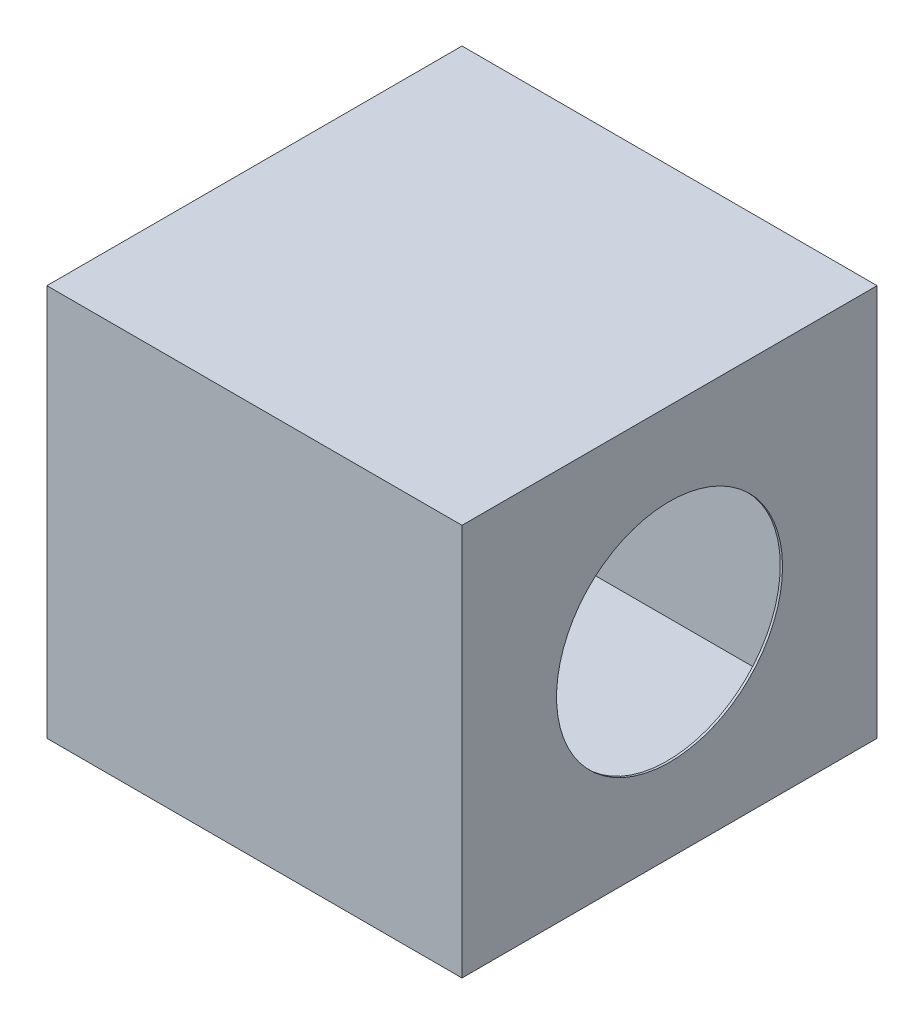
ISO-10303-21;
HEADER;
FILE_DESCRIPTION(('STEP AP214'),'2;1');
FILE_NAME('part.step','',(''),(''),'','','');
FILE_SCHEMA(('AUTOMOTIVE_DESIGN { 1 0 10303 214 1 1 1 1 }'));
ENDSEC;
DATA;
#1=APPLICATION_CONTEXT('core data for automotive mechanical design processes');
#2=APPLICATION_PROTOCOL_DEFINITION('international standard','automotive_design',2000,#1);
#3=PRODUCT_CONTEXT('',#1,'mechanical');
#4=PRODUCT('Part','Part','',(#3));
#5=PRODUCT_RELATED_PRODUCT_CATEGORY('part','',(#4));
#6=PRODUCT_DEFINITION_FORMATION('','',#4);
#7=PRODUCT_DEFINITION_CONTEXT('part definition',#1,'design');
#8=PRODUCT_DEFINITION('design','',#6,#7);
#9=PRODUCT_DEFINITION_SHAPE('','',#8);
#10=(LENGTH_UNIT() NAMED_UNIT(*) SI_UNIT(.MILLI.,.METRE.));
#11=(NAMED_UNIT(*) PLANE_ANGLE_UNIT() SI_UNIT($,.RADIAN.));
#12=(NAMED_UNIT(*) SI_UNIT($,.STERADIAN.) SOLID_ANGLE_UNIT());
#13=UNCERTAINTY_MEASURE_WITH_UNIT(LENGTH_MEASURE(1.E-05),#10,'distance_accuracy_value','');
#14=(GEOMETRIC_REPRESENTATION_CONTEXT(3) GLOBAL_UNCERTAINTY_ASSIGNED_CONTEXT((#13)) GLOBAL_UNIT_ASSIGNED_CONTEXT((#10,
#11,#12)) REPRESENTATION_CONTEXT('',''));
#15=CARTESIAN_POINT('',(0.,0.,0.));
#16=DIRECTION('',(0.,0.,1.));
#17=DIRECTION('',(1.,0.,0.));
#18=AXIS2_PLACEMENT_3D('',#15,#16,#17);
#19=CARTESIAN_POINT('',(90.,85.,90.));
#20=DIRECTION('',(-1.,0.,0.));
#21=DIRECTION('',(0.,0.,1.));
#22=AXIS2_PLACEMENT_3D('',#19,#20,#21);
#23=PLANE('',#22);
#24=CARTESIAN_POINT('',(90.,0.,0.));
#25=DIRECTION('',(1.,0.,0.));
#26=DIRECTION('',(0.,0.,-1.));
#27=AXIS2_PLACEMENT_3D('',#24,#25,#26);
#28=CIRCLE('',#27,49.);
#29=CARTESIAN_POINT('',(90.,0.,-49.));
#30=VERTEX_POINT('',#29);
#31=EDGE_CURVE('E147',#30,#30,#28,.T.);
#32=ORIENTED_EDGE('',*,*,#31,.F.);
#33=EDGE_LOOP('',(#32));
#34=FACE_BOUND('',#33,.T.);
#35=DIRECTION('',(0.,1.,0.));
#36=VECTOR('',#35,1.);
#37=CARTESIAN_POINT('',(90.,85.,-90.));
#38=LINE('',#37,#36);
#39=CARTESIAN_POINT('',(90.,-85.,-90.));
#40=VERTEX_POINT('',#39);
#41=CARTESIAN_POINT('',(90.,85.,-90.));
#42=VERTEX_POINT('',#41);
#43=EDGE_CURVE('E155',#40,#42,#38,.T.);
#44=ORIENTED_EDGE('',*,*,#43,.T.);
#45=DIRECTION('',(0.,0.,-1.));
#46=VECTOR('',#45,1.);
#47=CARTESIAN_POINT('',(90.,85.,90.));
#48=LINE('',#47,#46);
#49=CARTESIAN_POINT('',(90.,85.,90.));
#50=VERTEX_POINT('',#49);
#51=EDGE_CURVE('E11',#50,#42,#48,.T.);
#52=ORIENTED_EDGE('',*,*,#51,.F.);
#53=DIRECTION('',(0.,1.,0.));
#54=VECTOR('',#53,1.);
#55=CARTESIAN_POINT('',(90.,85.,90.));
#56=LINE('',#55,#54);
#57=CARTESIAN_POINT('',(90.,-85.,90.));
#58=VERTEX_POINT('',#57);
#59=EDGE_CURVE('E156',#58,#50,#56,.T.);
#60=ORIENTED_EDGE('',*,*,#59,.F.);
#61=DIRECTION('',(0.,0.,-1.));
#62=VECTOR('',#61,1.);
#63=CARTESIAN_POINT('',(90.,-85.,90.));
#64=LINE('',#63,#62);
#65=EDGE_CURVE('E162',#58,#40,#64,.T.);
#66=ORIENTED_EDGE('',*,*,#65,.T.);
#67=EDGE_LOOP('',(#44,#52,#60,#66));
#68=FACE_BOUND('',#67,.T.);
#69=ADVANCED_FACE('F33',(#34,#68),#23,.F.);
#70=CARTESIAN_POINT('',(-90.,85.,90.));
#71=DIRECTION('',(0.,-1.,0.));
#72=DIRECTION('',(1.,0.,0.));
#73=AXIS2_PLACEMENT_3D('',#70,#71,#72);
#74=PLANE('',#73);
#75=DIRECTION('',(-1.,0.,0.));
#76=VECTOR('',#75,1.);
#77=CARTESIAN_POINT('',(-90.,85.,-90.));
#78=LINE('',#77,#76);
#79=CARTESIAN_POINT('',(-90.,85.,-90.));
#80=VERTEX_POINT('',#79);
#81=EDGE_CURVE('E165',#42,#80,#78,.T.);
#82=ORIENTED_EDGE('',*,*,#81,.T.);
#83=DIRECTION('',(0.,0.,-1.));
#84=VECTOR('',#83,1.);
#85=CARTESIAN_POINT('',(-90.,85.,90.));
#86=LINE('',#85,#84);
#87=CARTESIAN_POINT('',(-90.,85.,90.));
#88=VERTEX_POINT('',#87);
#89=EDGE_CURVE('E41',#88,#80,#86,.T.);
#90=ORIENTED_EDGE('',*,*,#89,.F.);
#91=DIRECTION('',(-1.,0.,0.));
#92=VECTOR('',#91,1.);
#93=CARTESIAN_POINT('',(-90.,85.,90.));
#94=LINE('',#93,#92);
#95=EDGE_CURVE('E80',#50,#88,#94,.T.);
#96=ORIENTED_EDGE('',*,*,#95,.F.);
#97=ORIENTED_EDGE('',*,*,#51,.T.);
#98=EDGE_LOOP('',(#82,#90,#96,#97));
#99=FACE_BOUND('',#98,.T.);
#100=ADVANCED_FACE('F188',(#99),#74,.F.);
#101=CARTESIAN_POINT('',(-90.,85.,90.));
#102=DIRECTION('',(1.,0.,0.));
#103=DIRECTION('',(0.,0.,-1.));
#104=AXIS2_PLACEMENT_3D('',#101,#102,#103);
#105=PLANE('',#104);
#106=CARTESIAN_POINT('',(-90.,0.,0.));
#107=DIRECTION('',(-1.,0.,0.));
#108=DIRECTION('',(0.,0.,1.));
#109=AXIS2_PLACEMENT_3D('',#106,#107,#108);
#110=CIRCLE('',#109,49.);
#111=CARTESIAN_POINT('',(-90.,0.,49.));
#112=VERTEX_POINT('',#111);
#113=EDGE_CURVE('E150',#112,#112,#110,.T.);
#114=ORIENTED_EDGE('',*,*,#113,.F.);
#115=EDGE_LOOP('',(#114));
#116=FACE_BOUND('',#115,.T.);
#117=DIRECTION('',(0.,-1.,0.));
#118=VECTOR('',#117,1.);
#119=CARTESIAN_POINT('',(-90.,85.,-90.));
#120=LINE('',#119,#118);
#121=CARTESIAN_POINT('',(-90.,-85.,-90.));
#122=VERTEX_POINT('',#121);
#123=EDGE_CURVE('E67',#80,#122,#120,.T.);
#124=ORIENTED_EDGE('',*,*,#123,.T.);
#125=DIRECTION('',(0.,0.,-1.));
#126=VECTOR('',#125,1.);
#127=CARTESIAN_POINT('',(-90.,-85.,90.));
#128=LINE('',#127,#126);
#129=CARTESIAN_POINT('',(-90.,-85.,90.));
#130=VERTEX_POINT('',#129);
#131=EDGE_CURVE('E170',#130,#122,#128,.T.);
#132=ORIENTED_EDGE('',*,*,#131,.F.);
#133=DIRECTION('',(0.,-1.,0.));
#134=VECTOR('',#133,1.);
#135=CARTESIAN_POINT('',(-90.,85.,90.));
#136=LINE('',#135,#134);
#137=EDGE_CURVE('E159',#88,#130,#136,.T.);
#138=ORIENTED_EDGE('',*,*,#137,.F.);
#139=ORIENTED_EDGE('',*,*,#89,.T.);
#140=EDGE_LOOP('',(#124,#132,#138,#139));
#141=FACE_BOUND('',#140,.T.);
#142=ADVANCED_FACE('F172',(#116,#141),#105,.F.);
#143=CARTESIAN_POINT('',(-90.,-85.,90.));
#144=DIRECTION('',(0.,1.,0.));
#145=DIRECTION('',(0.,0.,1.));
#146=AXIS2_PLACEMENT_3D('',#143,#144,#145);
#147=PLANE('',#146);
#148=DIRECTION('',(1.,0.,0.));
#149=VECTOR('',#148,1.);
#150=CARTESIAN_POINT('',(-90.,-85.,-90.));
#151=LINE('',#150,#149);
#152=EDGE_CURVE('E73',#122,#40,#151,.T.);
#153=ORIENTED_EDGE('',*,*,#152,.T.);
#154=ORIENTED_EDGE('',*,*,#65,.F.);
#155=DIRECTION('',(1.,0.,0.));
#156=VECTOR('',#155,1.);
#157=CARTESIAN_POINT('',(-90.,-85.,90.));
#158=LINE('',#157,#156);
#159=EDGE_CURVE('E49',#130,#58,#158,.T.);
#160=ORIENTED_EDGE('',*,*,#159,.F.);
#161=ORIENTED_EDGE('',*,*,#131,.T.);
#162=EDGE_LOOP('',(#153,#154,#160,#161));
#163=FACE_BOUND('',#162,.T.);
#164=ADVANCED_FACE('F179',(#163),#147,.F.);
#165=CARTESIAN_POINT('',(0.,0.,90.));
#166=DIRECTION('',(0.,0.,1.));
#167=DIRECTION('',(1.,0.,0.));
#168=AXIS2_PLACEMENT_3D('',#165,#166,#167);
#169=PLANE('',#168);
#170=ORIENTED_EDGE('',*,*,#59,.T.);
#171=ORIENTED_EDGE('',*,*,#95,.T.);
#172=ORIENTED_EDGE('',*,*,#137,.T.);
#173=ORIENTED_EDGE('',*,*,#159,.T.);
#174=EDGE_LOOP('',(#170,#171,#172,#173));
#175=FACE_BOUND('',#174,.T.);
#176=ADVANCED_FACE('F181',(#175),#169,.T.);
#177=CARTESIAN_POINT('',(0.,0.,-90.));
#178=DIRECTION('',(0.,0.,1.));
#179=DIRECTION('',(1.,0.,0.));
#180=AXIS2_PLACEMENT_3D('',#177,#178,#179);
#181=PLANE('',#180);
#182=ORIENTED_EDGE('',*,*,#43,.F.);
#183=ORIENTED_EDGE('',*,*,#152,.F.);
#184=ORIENTED_EDGE('',*,*,#123,.F.);
#185=ORIENTED_EDGE('',*,*,#81,.F.);
#186=EDGE_LOOP('',(#182,#183,#184,#185));
#187=FACE_BOUND('',#186,.T.);
#188=ADVANCED_FACE('F175',(#187),#181,.F.);
#189=CARTESIAN_POINT('',(-89.,0.,0.));
#190=DIRECTION('',(-1.,0.,0.));
#191=DIRECTION('',(0.,0.,1.));
#192=AXIS2_PLACEMENT_3D('',#189,#190,#191);
#193=CYLINDRICAL_SURFACE('',#192,49.);
#194=CARTESIAN_POINT('',(-89.,0.,0.));
#195=DIRECTION('',(-1.,0.,0.));
#196=DIRECTION('',(0.,0.,1.));
#197=AXIS2_PLACEMENT_3D('',#194,#195,#196);
#198=CIRCLE('',#197,49.);
#199=CARTESIAN_POINT('',(-89.,0.,49.));
#200=VERTEX_POINT('',#199);
#201=EDGE_CURVE('E146',#200,#200,#198,.T.);
#202=ORIENTED_EDGE('',*,*,#201,.F.);
#203=EDGE_LOOP('',(#202));
#204=FACE_BOUND('',#203,.T.);
#205=ORIENTED_EDGE('',*,*,#113,.T.);
#206=EDGE_LOOP('',(#205));
#207=FACE_BOUND('',#206,.T.);
#208=ADVANCED_FACE('F201',(#204,#207),#193,.F.);
#209=CARTESIAN_POINT('',(89.,0.,0.));
#210=DIRECTION('',(1.,0.,0.));
#211=DIRECTION('',(0.,0.,-1.));
#212=AXIS2_PLACEMENT_3D('',#209,#210,#211);
#213=CYLINDRICAL_SURFACE('',#212,49.);
#214=CARTESIAN_POINT('',(89.,0.,0.));
#215=DIRECTION('',(1.,0.,0.));
#216=DIRECTION('',(0.,0.,-1.));
#217=AXIS2_PLACEMENT_3D('',#214,#215,#216);
#218=CIRCLE('',#217,49.);
#219=CARTESIAN_POINT('',(89.,0.,-49.));
#220=VERTEX_POINT('',#219);
#221=EDGE_CURVE('E143',#220,#220,#218,.T.);
#222=ORIENTED_EDGE('',*,*,#221,.F.);
#223=EDGE_LOOP('',(#222));
#224=FACE_BOUND('',#223,.T.);
#225=ORIENTED_EDGE('',*,*,#31,.T.);
#226=EDGE_LOOP('',(#225));
#227=FACE_BOUND('',#226,.T.);
#228=ADVANCED_FACE('F199',(#224,#227),#213,.F.);
#229=CARTESIAN_POINT('',(-89.,85.,90.));
#230=DIRECTION('',(1.,0.,0.));
#231=DIRECTION('',(0.,0.,-1.));
#232=AXIS2_PLACEMENT_3D('',#229,#230,#231);
#233=PLANE('',#232);
#234=DIRECTION('',(0.,-1.,0.));
#235=VECTOR('',#234,1.);
#236=CARTESIAN_POINT('',(-89.,85.,-89.));
#237=LINE('',#236,#235);
#238=CARTESIAN_POINT('',(-89.,84.,-89.));
#239=VERTEX_POINT('',#238);
#240=CARTESIAN_POINT('',(-89.,-84.,-89.));
#241=VERTEX_POINT('',#240);
#242=EDGE_CURVE('E110',#239,#241,#237,.T.);
#243=ORIENTED_EDGE('',*,*,#242,.F.);
#244=DIRECTION('',(0.,0.,-1.));
#245=VECTOR('',#244,1.);
#246=CARTESIAN_POINT('',(-89.,84.,90.));
#247=LINE('',#246,#245);
#248=CARTESIAN_POINT('',(-89.,84.,89.));
#249=VERTEX_POINT('',#248);
#250=EDGE_CURVE('E119',#249,#239,#247,.T.);
#251=ORIENTED_EDGE('',*,*,#250,.F.);
#252=DIRECTION('',(0.,-1.,0.));
#253=VECTOR('',#252,1.);
#254=CARTESIAN_POINT('',(-89.,85.,89.));
#255=LINE('',#254,#253);
#256=CARTESIAN_POINT('',(-89.,-84.,89.));
#257=VERTEX_POINT('',#256);
#258=EDGE_CURVE('E139',#249,#257,#255,.T.);
#259=ORIENTED_EDGE('',*,*,#258,.T.);
#260=DIRECTION('',(0.,0.,-1.));
#261=VECTOR('',#260,1.);
#262=CARTESIAN_POINT('',(-89.,-84.,90.));
#263=LINE('',#262,#261);
#264=EDGE_CURVE('E125',#257,#241,#263,.T.);
#265=ORIENTED_EDGE('',*,*,#264,.T.);
#266=EDGE_LOOP('',(#243,#251,#259,#265));
#267=FACE_BOUND('',#266,.T.);
#268=ORIENTED_EDGE('',*,*,#201,.T.);
#269=EDGE_LOOP('',(#268));
#270=FACE_BOUND('',#269,.T.);
#271=ADVANCED_FACE('F127',(#267,#270),#233,.T.);
#272=CARTESIAN_POINT('',(89.,85.,90.));
#273=DIRECTION('',(-1.,0.,0.));
#274=DIRECTION('',(0.,0.,1.));
#275=AXIS2_PLACEMENT_3D('',#272,#273,#274);
#276=PLANE('',#275);
#277=DIRECTION('',(0.,1.,0.));
#278=VECTOR('',#277,1.);
#279=CARTESIAN_POINT('',(89.,85.,-89.));
#280=LINE('',#279,#278);
#281=CARTESIAN_POINT('',(89.,-84.,-89.));
#282=VERTEX_POINT('',#281);
#283=CARTESIAN_POINT('',(89.,84.,-89.));
#284=VERTEX_POINT('',#283);
#285=EDGE_CURVE('E113',#282,#284,#280,.T.);
#286=ORIENTED_EDGE('',*,*,#285,.F.);
#287=DIRECTION('',(0.,0.,-1.));
#288=VECTOR('',#287,1.);
#289=CARTESIAN_POINT('',(89.,-84.,90.));
#290=LINE('',#289,#288);
#291=CARTESIAN_POINT('',(89.,-84.,89.));
#292=VERTEX_POINT('',#291);
#293=EDGE_CURVE('E138',#292,#282,#290,.T.);
#294=ORIENTED_EDGE('',*,*,#293,.F.);
#295=DIRECTION('',(0.,1.,0.));
#296=VECTOR('',#295,1.);
#297=CARTESIAN_POINT('',(89.,85.,89.));
#298=LINE('',#297,#296);
#299=CARTESIAN_POINT('',(89.,84.,89.));
#300=VERTEX_POINT('',#299);
#301=EDGE_CURVE('E133',#292,#300,#298,.T.);
#302=ORIENTED_EDGE('',*,*,#301,.T.);
#303=DIRECTION('',(0.,0.,-1.));
#304=VECTOR('',#303,1.);
#305=CARTESIAN_POINT('',(89.,84.,90.));
#306=LINE('',#305,#304);
#307=EDGE_CURVE('E124',#300,#284,#306,.T.);
#308=ORIENTED_EDGE('',*,*,#307,.T.);
#309=EDGE_LOOP('',(#286,#294,#302,#308));
#310=FACE_BOUND('',#309,.T.);
#311=ORIENTED_EDGE('',*,*,#221,.T.);
#312=EDGE_LOOP('',(#311));
#313=FACE_BOUND('',#312,.T.);
#314=ADVANCED_FACE('F208',(#310,#313),#276,.T.);
#315=CARTESIAN_POINT('',(-90.,84.,90.));
#316=DIRECTION('',(0.,-1.,0.));
#317=DIRECTION('',(1.,0.,0.));
#318=AXIS2_PLACEMENT_3D('',#315,#316,#317);
#319=PLANE('',#318);
#320=DIRECTION('',(-1.,0.,0.));
#321=VECTOR('',#320,1.);
#322=CARTESIAN_POINT('',(-90.,84.,-89.));
#323=LINE('',#322,#321);
#324=EDGE_CURVE('E106',#284,#239,#323,.T.);
#325=ORIENTED_EDGE('',*,*,#324,.F.);
#326=ORIENTED_EDGE('',*,*,#307,.F.);
#327=DIRECTION('',(-1.,0.,0.));
#328=VECTOR('',#327,1.);
#329=CARTESIAN_POINT('',(-90.,84.,89.));
#330=LINE('',#329,#328);
#331=EDGE_CURVE('E121',#300,#249,#330,.T.);
#332=ORIENTED_EDGE('',*,*,#331,.T.);
#333=ORIENTED_EDGE('',*,*,#250,.T.);
#334=EDGE_LOOP('',(#325,#326,#332,#333));
#335=FACE_BOUND('',#334,.T.);
#336=ADVANCED_FACE('F120',(#335),#319,.T.);
#337=CARTESIAN_POINT('',(-90.,-84.,90.));
#338=DIRECTION('',(0.,1.,0.));
#339=DIRECTION('',(0.,0.,1.));
#340=AXIS2_PLACEMENT_3D('',#337,#338,#339);
#341=PLANE('',#340);
#342=DIRECTION('',(1.,0.,0.));
#343=VECTOR('',#342,1.);
#344=CARTESIAN_POINT('',(-90.,-84.,-89.));
#345=LINE('',#344,#343);
#346=EDGE_CURVE('E131',#241,#282,#345,.T.);
#347=ORIENTED_EDGE('',*,*,#346,.F.);
#348=ORIENTED_EDGE('',*,*,#264,.F.);
#349=DIRECTION('',(1.,0.,0.));
#350=VECTOR('',#349,1.);
#351=CARTESIAN_POINT('',(-90.,-84.,89.));
#352=LINE('',#351,#350);
#353=EDGE_CURVE('E140',#257,#292,#352,.T.);
#354=ORIENTED_EDGE('',*,*,#353,.T.);
#355=ORIENTED_EDGE('',*,*,#293,.T.);
#356=EDGE_LOOP('',(#347,#348,#354,#355));
#357=FACE_BOUND('',#356,.T.);
#358=ADVANCED_FACE('F263',(#357),#341,.T.);
#359=CARTESIAN_POINT('',(0.,0.,89.));
#360=DIRECTION('',(0.,0.,1.));
#361=DIRECTION('',(1.,0.,0.));
#362=AXIS2_PLACEMENT_3D('',#359,#360,#361);
#363=PLANE('',#362);
#364=ORIENTED_EDGE('',*,*,#301,.F.);
#365=ORIENTED_EDGE('',*,*,#353,.F.);
#366=ORIENTED_EDGE('',*,*,#258,.F.);
#367=ORIENTED_EDGE('',*,*,#331,.F.);
#368=EDGE_LOOP('',(#364,#365,#366,#367));
#369=FACE_BOUND('',#368,.T.);
#370=ADVANCED_FACE('F271',(#369),#363,.F.);
#371=CARTESIAN_POINT('',(0.,0.,-89.));
#372=DIRECTION('',(0.,0.,1.));
#373=DIRECTION('',(1.,0.,0.));
#374=AXIS2_PLACEMENT_3D('',#371,#372,#373);
#375=PLANE('',#374);
#376=ORIENTED_EDGE('',*,*,#285,.T.);
#377=ORIENTED_EDGE('',*,*,#324,.T.);
#378=ORIENTED_EDGE('',*,*,#242,.T.);
#379=ORIENTED_EDGE('',*,*,#346,.T.);
#380=EDGE_LOOP('',(#376,#377,#378,#379));
#381=FACE_BOUND('',#380,.T.);
#382=ADVANCED_FACE('F108',(#381),#375,.T.);
#383=CLOSED_SHELL('',(#69,#100,#142,#164,#176,#188,#208,#228,#271,#314,#336,#358,#370,#382));
#384=MANIFOLD_SOLID_BREP('B2',#383);
#385=ADVANCED_BREP_SHAPE_REPRESENTATION('',(#18,#384),#14);
#386=SHAPE_DEFINITION_REPRESENTATION(#9,#385);
ENDSEC;
END-ISO-10303-21;
